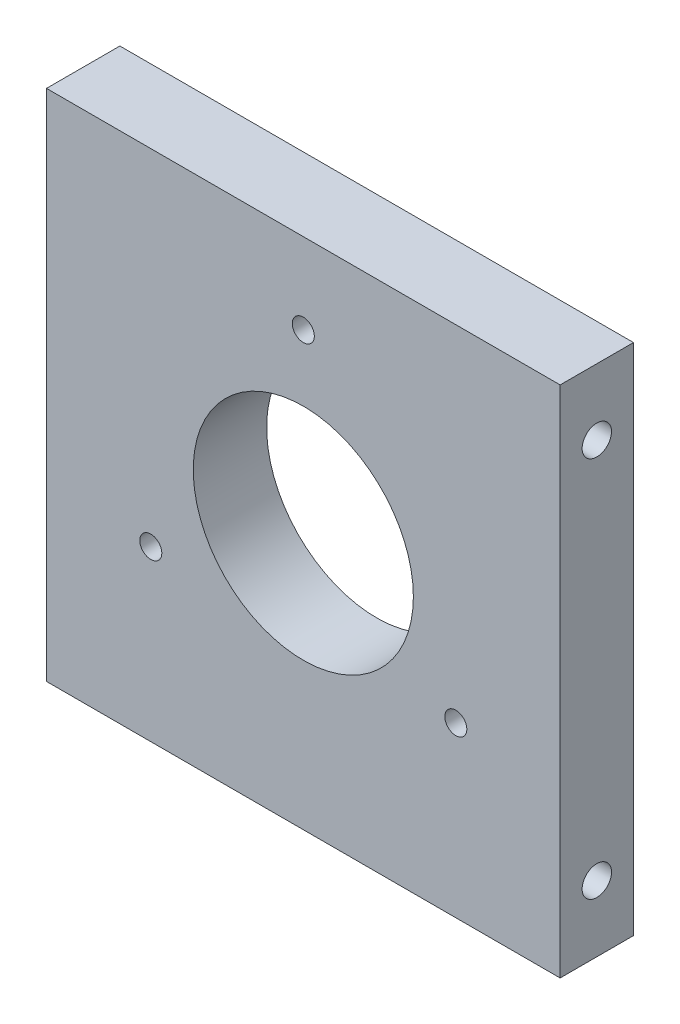
ISO-10303-21;
HEADER;
FILE_DESCRIPTION(('STEP AP214'),'2;1');
FILE_NAME('part.step','',(''),(''),'','','');
FILE_SCHEMA(('AUTOMOTIVE_DESIGN { 1 0 10303 214 1 1 1 1 }'));
ENDSEC;
DATA;
#1=APPLICATION_CONTEXT('core data for automotive mechanical design processes');
#2=APPLICATION_PROTOCOL_DEFINITION('international standard','automotive_design',2000,#1);
#3=PRODUCT_CONTEXT('',#1,'mechanical');
#4=PRODUCT('Part','Part','',(#3));
#5=PRODUCT_RELATED_PRODUCT_CATEGORY('part','',(#4));
#6=PRODUCT_DEFINITION_FORMATION('','',#4);
#7=PRODUCT_DEFINITION_CONTEXT('part definition',#1,'design');
#8=PRODUCT_DEFINITION('design','',#6,#7);
#9=PRODUCT_DEFINITION_SHAPE('','',#8);
#10=(LENGTH_UNIT() NAMED_UNIT(*) SI_UNIT(.MILLI.,.METRE.));
#11=(NAMED_UNIT(*) PLANE_ANGLE_UNIT() SI_UNIT($,.RADIAN.));
#12=(NAMED_UNIT(*) SI_UNIT($,.STERADIAN.) SOLID_ANGLE_UNIT());
#13=UNCERTAINTY_MEASURE_WITH_UNIT(LENGTH_MEASURE(1.E-05),#10,'distance_accuracy_value','');
#14=(GEOMETRIC_REPRESENTATION_CONTEXT(3) GLOBAL_UNCERTAINTY_ASSIGNED_CONTEXT((#13)) GLOBAL_UNIT_ASSIGNED_CONTEXT((#10,
#11,#12)) REPRESENTATION_CONTEXT('',''));
#15=CARTESIAN_POINT('',(0.,0.,0.));
#16=DIRECTION('',(0.,0.,1.));
#17=DIRECTION('',(1.,0.,0.));
#18=AXIS2_PLACEMENT_3D('',#15,#16,#17);
#19=CARTESIAN_POINT('',(12.0014,61.,5.0105));
#20=DIRECTION('',(1.,0.,0.));
#21=DIRECTION('',(0.,0.,-1.));
#22=AXIS2_PLACEMENT_3D('',#19,#20,#21);
#23=PLANE('',#22);
#24=CARTESIAN_POINT('',(12.0014,61.,5.0105));
#25=DIRECTION('',(1.,0.,0.));
#26=DIRECTION('',(0.,0.,-1.));
#27=AXIS2_PLACEMENT_3D('',#24,#25,#26);
#28=CIRCLE('',#27,2.);
#29=CARTESIAN_POINT('',(12.0014,61.,3.0105));
#30=VERTEX_POINT('',#29);
#31=EDGE_CURVE('E19',#30,#30,#28,.F.);
#32=ORIENTED_EDGE('',*,*,#31,.T.);
#33=EDGE_LOOP('',(#32));
#34=FACE_BOUND('',#33,.T.);
#35=ADVANCED_FACE('F16',(#34),#23,.F.);
#36=CARTESIAN_POINT('',(12.0014,9.,5.0105));
#37=DIRECTION('',(1.,0.,0.));
#38=DIRECTION('',(0.,0.,-1.));
#39=AXIS2_PLACEMENT_3D('',#36,#37,#38);
#40=PLANE('',#39);
#41=CARTESIAN_POINT('',(12.0014,9.,5.0105));
#42=DIRECTION('',(1.,0.,0.));
#43=DIRECTION('',(0.,0.,-1.));
#44=AXIS2_PLACEMENT_3D('',#41,#42,#43);
#45=CIRCLE('',#44,2.);
#46=CARTESIAN_POINT('',(12.0014,9.,3.0105));
#47=VERTEX_POINT('',#46);
#48=EDGE_CURVE('E122',#47,#47,#45,.F.);
#49=ORIENTED_EDGE('',*,*,#48,.T.);
#50=EDGE_LOOP('',(#49));
#51=FACE_BOUND('',#50,.T.);
#52=ADVANCED_FACE('F200',(#51),#40,.F.);
#53=CARTESIAN_POINT('',(58.0014,61.,5.0105));
#54=DIRECTION('',(-1.,0.,0.));
#55=DIRECTION('',(0.,0.,1.));
#56=AXIS2_PLACEMENT_3D('',#53,#54,#55);
#57=PLANE('',#56);
#58=CARTESIAN_POINT('',(58.0014,61.,5.0105));
#59=DIRECTION('',(-1.,0.,0.));
#60=DIRECTION('',(0.,0.,1.));
#61=AXIS2_PLACEMENT_3D('',#58,#59,#60);
#62=CIRCLE('',#61,2.);
#63=CARTESIAN_POINT('',(58.0014,61.,7.0105));
#64=VERTEX_POINT('',#63);
#65=EDGE_CURVE('E120',#64,#64,#62,.F.);
#66=ORIENTED_EDGE('',*,*,#65,.T.);
#67=EDGE_LOOP('',(#66));
#68=FACE_BOUND('',#67,.T.);
#69=ADVANCED_FACE('F144',(#68),#57,.F.);
#70=CARTESIAN_POINT('',(58.0014,9.,5.0105));
#71=DIRECTION('',(-1.,0.,0.));
#72=DIRECTION('',(0.,0.,1.));
#73=AXIS2_PLACEMENT_3D('',#70,#71,#72);
#74=PLANE('',#73);
#75=CARTESIAN_POINT('',(58.0014,9.,5.0105));
#76=DIRECTION('',(-1.,0.,0.));
#77=DIRECTION('',(0.,0.,1.));
#78=AXIS2_PLACEMENT_3D('',#75,#76,#77);
#79=CIRCLE('',#78,2.);
#80=CARTESIAN_POINT('',(58.0014,9.,7.0105));
#81=VERTEX_POINT('',#80);
#82=EDGE_CURVE('E74',#81,#81,#79,.F.);
#83=ORIENTED_EDGE('',*,*,#82,.T.);
#84=EDGE_LOOP('',(#83));
#85=FACE_BOUND('',#84,.T.);
#86=ADVANCED_FACE('F133',(#85),#74,.F.);
#87=CARTESIAN_POINT('',(0.00139999999999,61.,5.0105));
#88=DIRECTION('',(1.,0.,0.));
#89=DIRECTION('',(0.,0.,-1.));
#90=AXIS2_PLACEMENT_3D('',#87,#88,#89);
#91=CYLINDRICAL_SURFACE('',#90,2.);
#92=CARTESIAN_POINT('',(0.00139999999999,61.,5.0105));
#93=DIRECTION('',(1.,0.,0.));
#94=DIRECTION('',(0.,0.,-1.));
#95=AXIS2_PLACEMENT_3D('',#92,#93,#94);
#96=CIRCLE('',#95,2.);
#97=CARTESIAN_POINT('',(0.00139999999999,61.,3.0105));
#98=VERTEX_POINT('',#97);
#99=EDGE_CURVE('E73',#98,#98,#96,.F.);
#100=ORIENTED_EDGE('',*,*,#99,.T.);
#101=EDGE_LOOP('',(#100));
#102=FACE_BOUND('',#101,.T.);
#103=ORIENTED_EDGE('',*,*,#31,.F.);
#104=EDGE_LOOP('',(#103));
#105=FACE_BOUND('',#104,.T.);
#106=ADVANCED_FACE('F130',(#102,#105),#91,.F.);
#107=CARTESIAN_POINT('',(0.00139999999999,9.,5.0105));
#108=DIRECTION('',(1.,0.,0.));
#109=DIRECTION('',(0.,0.,-1.));
#110=AXIS2_PLACEMENT_3D('',#107,#108,#109);
#111=CYLINDRICAL_SURFACE('',#110,2.);
#112=CARTESIAN_POINT('',(0.00139999999999,9.,5.0105));
#113=DIRECTION('',(1.,0.,0.));
#114=DIRECTION('',(0.,0.,-1.));
#115=AXIS2_PLACEMENT_3D('',#112,#113,#114);
#116=CIRCLE('',#115,2.);
#117=CARTESIAN_POINT('',(0.00139999999999,9.,3.0105));
#118=VERTEX_POINT('',#117);
#119=EDGE_CURVE('E65',#118,#118,#116,.F.);
#120=ORIENTED_EDGE('',*,*,#119,.T.);
#121=EDGE_LOOP('',(#120));
#122=FACE_BOUND('',#121,.T.);
#123=ORIENTED_EDGE('',*,*,#48,.F.);
#124=EDGE_LOOP('',(#123));
#125=FACE_BOUND('',#124,.T.);
#126=ADVANCED_FACE('F132',(#122,#125),#111,.F.);
#127=CARTESIAN_POINT('',(70.0014,61.,5.0105));
#128=DIRECTION('',(-1.,0.,0.));
#129=DIRECTION('',(0.,0.,1.));
#130=AXIS2_PLACEMENT_3D('',#127,#128,#129);
#131=CYLINDRICAL_SURFACE('',#130,2.);
#132=CARTESIAN_POINT('',(70.0014,61.,5.0105));
#133=DIRECTION('',(-1.,0.,0.));
#134=DIRECTION('',(0.,0.,1.));
#135=AXIS2_PLACEMENT_3D('',#132,#133,#134);
#136=CIRCLE('',#135,2.);
#137=CARTESIAN_POINT('',(70.0014,61.,7.0105));
#138=VERTEX_POINT('',#137);
#139=EDGE_CURVE('E111',#138,#138,#136,.T.);
#140=ORIENTED_EDGE('',*,*,#139,.F.);
#141=EDGE_LOOP('',(#140));
#142=FACE_BOUND('',#141,.T.);
#143=ORIENTED_EDGE('',*,*,#65,.F.);
#144=EDGE_LOOP('',(#143));
#145=FACE_BOUND('',#144,.T.);
#146=ADVANCED_FACE('F141',(#142,#145),#131,.F.);
#147=CARTESIAN_POINT('',(70.0014,9.,5.0105));
#148=DIRECTION('',(-1.,0.,0.));
#149=DIRECTION('',(0.,0.,1.));
#150=AXIS2_PLACEMENT_3D('',#147,#148,#149);
#151=CYLINDRICAL_SURFACE('',#150,2.);
#152=CARTESIAN_POINT('',(70.0014,9.,5.0105));
#153=DIRECTION('',(-1.,0.,0.));
#154=DIRECTION('',(0.,0.,1.));
#155=AXIS2_PLACEMENT_3D('',#152,#153,#154);
#156=CIRCLE('',#155,2.);
#157=CARTESIAN_POINT('',(70.0014,9.,7.0105));
#158=VERTEX_POINT('',#157);
#159=EDGE_CURVE('E107',#158,#158,#156,.T.);
#160=ORIENTED_EDGE('',*,*,#159,.F.);
#161=EDGE_LOOP('',(#160));
#162=FACE_BOUND('',#161,.T.);
#163=ORIENTED_EDGE('',*,*,#82,.F.);
#164=EDGE_LOOP('',(#163));
#165=FACE_BOUND('',#164,.T.);
#166=ADVANCED_FACE('F186',(#162,#165),#151,.F.);
#167=CARTESIAN_POINT('',(0.00139999999999,0.,0.01050000000032));
#168=DIRECTION('',(0.,0.,1.));
#169=DIRECTION('',(1.,0.,0.));
#170=AXIS2_PLACEMENT_3D('',#167,#168,#169);
#171=PLANE('',#170);
#172=CARTESIAN_POINT('',(35.0014,59.,0.01050000000009));
#173=DIRECTION('',(0.,0.,1.));
#174=DIRECTION('',(1.,0.,0.));
#175=AXIS2_PLACEMENT_3D('',#172,#173,#174);
#176=CIRCLE('',#175,1.5);
#177=CARTESIAN_POINT('',(36.5014,59.,0.01050000000009));
#178=VERTEX_POINT('',#177);
#179=EDGE_CURVE('E94',#178,#178,#176,.T.);
#180=ORIENTED_EDGE('',*,*,#179,.T.);
#181=EDGE_LOOP('',(#180));
#182=FACE_BOUND('',#181,.T.);
#183=CARTESIAN_POINT('',(35.0014,35.,0.01050000000009));
#184=DIRECTION('',(0.,0.,1.));
#185=DIRECTION('',(1.,0.,0.));
#186=AXIS2_PLACEMENT_3D('',#183,#184,#185);
#187=CIRCLE('',#186,15.);
#188=CARTESIAN_POINT('',(50.0014,35.,0.01050000000009));
#189=VERTEX_POINT('',#188);
#190=EDGE_CURVE('E98',#189,#189,#187,.T.);
#191=ORIENTED_EDGE('',*,*,#190,.T.);
#192=EDGE_LOOP('',(#191));
#193=FACE_BOUND('',#192,.T.);
#194=CARTESIAN_POINT('',(55.786009690827,23.,0.01050000000009));
#195=DIRECTION('',(0.,0.,1.));
#196=DIRECTION('',(1.,0.,0.));
#197=AXIS2_PLACEMENT_3D('',#194,#195,#196);
#198=CIRCLE('',#197,1.5);
#199=CARTESIAN_POINT('',(57.286009690827,23.,0.01050000000009));
#200=VERTEX_POINT('',#199);
#201=EDGE_CURVE('E101',#200,#200,#198,.T.);
#202=ORIENTED_EDGE('',*,*,#201,.T.);
#203=EDGE_LOOP('',(#202));
#204=FACE_BOUND('',#203,.T.);
#205=CARTESIAN_POINT('',(14.216790309173,23.,0.01050000000009));
#206=DIRECTION('',(0.,0.,1.));
#207=DIRECTION('',(1.,0.,0.));
#208=AXIS2_PLACEMENT_3D('',#205,#206,#207);
#209=CIRCLE('',#208,1.5);
#210=CARTESIAN_POINT('',(15.716790309173,23.,0.01050000000009));
#211=VERTEX_POINT('',#210);
#212=EDGE_CURVE('E104',#211,#211,#209,.T.);
#213=ORIENTED_EDGE('',*,*,#212,.T.);
#214=EDGE_LOOP('',(#213));
#215=FACE_BOUND('',#214,.T.);
#216=DIRECTION('',(0.,1.,0.));
#217=VECTOR('',#216,1.);
#218=CARTESIAN_POINT('',(70.0014,0.,0.01050000000009));
#219=LINE('',#218,#217);
#220=CARTESIAN_POINT('',(70.0014,0.,0.0105000000001475));
#221=VERTEX_POINT('',#220);
#222=CARTESIAN_POINT('',(70.0014,70.,0.010500000000205));
#223=VERTEX_POINT('',#222);
#224=EDGE_CURVE('E62',#221,#223,#219,.T.);
#225=ORIENTED_EDGE('',*,*,#224,.F.);
#226=DIRECTION('',(1.,0.,0.));
#227=VECTOR('',#226,1.);
#228=CARTESIAN_POINT('',(0.00139999999999,0.,0.01050000000009));
#229=LINE('',#228,#227);
#230=CARTESIAN_POINT('',(0.00139999999999,0.,0.010500000000205));
#231=VERTEX_POINT('',#230);
#232=EDGE_CURVE('E55',#221,#231,#229,.F.);
#233=ORIENTED_EDGE('',*,*,#232,.T.);
#234=DIRECTION('',(0.,1.,0.));
#235=VECTOR('',#234,1.);
#236=CARTESIAN_POINT('',(0.00139999999999,0.,0.01050000000009));
#237=LINE('',#236,#235);
#238=CARTESIAN_POINT('',(0.00139999999999,70.,0.010500000000205));
#239=VERTEX_POINT('',#238);
#240=EDGE_CURVE('E60',#231,#239,#237,.T.);
#241=ORIENTED_EDGE('',*,*,#240,.T.);
#242=DIRECTION('',(1.,0.,0.));
#243=VECTOR('',#242,1.);
#244=CARTESIAN_POINT('',(0.00139999999999,70.,0.01050000000009));
#245=LINE('',#244,#243);
#246=EDGE_CURVE('E110',#223,#239,#245,.F.);
#247=ORIENTED_EDGE('',*,*,#246,.F.);
#248=EDGE_LOOP('',(#225,#233,#241,#247));
#249=FACE_BOUND('',#248,.T.);
#250=ADVANCED_FACE('F59',(#182,#193,#204,#215,#249),#171,.F.);
#251=CARTESIAN_POINT('',(0.00139999999999,0.,0.01050000000032));
#252=DIRECTION('',(1.,0.,0.));
#253=DIRECTION('',(0.,0.,-1.));
#254=AXIS2_PLACEMENT_3D('',#251,#252,#253);
#255=PLANE('',#254);
#256=ORIENTED_EDGE('',*,*,#119,.F.);
#257=EDGE_LOOP('',(#256));
#258=FACE_BOUND('',#257,.T.);
#259=ORIENTED_EDGE('',*,*,#99,.F.);
#260=EDGE_LOOP('',(#259));
#261=FACE_BOUND('',#260,.T.);
#262=DIRECTION('',(0.,0.,1.));
#263=VECTOR('',#262,1.);
#264=CARTESIAN_POINT('',(0.00139999999999,70.,0.01050000000032));
#265=LINE('',#264,#263);
#266=CARTESIAN_POINT('',(0.00139999999999,70.,10.0105));
#267=VERTEX_POINT('',#266);
#268=EDGE_CURVE('E71',#239,#267,#265,.T.);
#269=ORIENTED_EDGE('',*,*,#268,.F.);
#270=ORIENTED_EDGE('',*,*,#240,.F.);
#271=DIRECTION('',(0.,0.,1.));
#272=VECTOR('',#271,1.);
#273=CARTESIAN_POINT('',(0.00139999999999,0.,0.01050000000032));
#274=LINE('',#273,#272);
#275=CARTESIAN_POINT('',(0.00139999999999,0.,10.0105));
#276=VERTEX_POINT('',#275);
#277=EDGE_CURVE('E64',#231,#276,#274,.T.);
#278=ORIENTED_EDGE('',*,*,#277,.T.);
#279=DIRECTION('',(0.,1.,0.));
#280=VECTOR('',#279,1.);
#281=CARTESIAN_POINT('',(0.00139999999999,0.,10.0105));
#282=LINE('',#281,#280);
#283=EDGE_CURVE('E97',#267,#276,#282,.F.);
#284=ORIENTED_EDGE('',*,*,#283,.F.);
#285=EDGE_LOOP('',(#269,#270,#278,#284));
#286=FACE_BOUND('',#285,.T.);
#287=ADVANCED_FACE('F68',(#258,#261,#286),#255,.F.);
#288=CARTESIAN_POINT('',(0.00139999999999,0.,0.01050000000032));
#289=DIRECTION('',(0.,1.,0.));
#290=DIRECTION('',(0.,0.,1.));
#291=AXIS2_PLACEMENT_3D('',#288,#289,#290);
#292=PLANE('',#291);
#293=DIRECTION('',(1.,0.,0.));
#294=VECTOR('',#293,1.);
#295=CARTESIAN_POINT('',(0.00139999999999,0.,10.0105));
#296=LINE('',#295,#294);
#297=CARTESIAN_POINT('',(70.0014,0.,10.0105));
#298=VERTEX_POINT('',#297);
#299=EDGE_CURVE('E78',#276,#298,#296,.T.);
#300=ORIENTED_EDGE('',*,*,#299,.F.);
#301=ORIENTED_EDGE('',*,*,#277,.F.);
#302=ORIENTED_EDGE('',*,*,#232,.F.);
#303=DIRECTION('',(0.,0.,-1.));
#304=VECTOR('',#303,1.);
#305=CARTESIAN_POINT('',(70.0014,0.,0.01050000000032));
#306=LINE('',#305,#304);
#307=EDGE_CURVE('E80',#298,#221,#306,.T.);
#308=ORIENTED_EDGE('',*,*,#307,.F.);
#309=EDGE_LOOP('',(#300,#301,#302,#308));
#310=FACE_BOUND('',#309,.T.);
#311=ADVANCED_FACE('F76',(#310),#292,.F.);
#312=CARTESIAN_POINT('',(70.0014,0.,0.01050000000032));
#313=DIRECTION('',(1.,0.,0.));
#314=DIRECTION('',(0.,0.,-1.));
#315=AXIS2_PLACEMENT_3D('',#312,#313,#314);
#316=PLANE('',#315);
#317=ORIENTED_EDGE('',*,*,#159,.T.);
#318=EDGE_LOOP('',(#317));
#319=FACE_BOUND('',#318,.T.);
#320=ORIENTED_EDGE('',*,*,#139,.T.);
#321=EDGE_LOOP('',(#320));
#322=FACE_BOUND('',#321,.T.);
#323=DIRECTION('',(0.,0.,1.));
#324=VECTOR('',#323,1.);
#325=CARTESIAN_POINT('',(70.0014,70.,0.01050000000032));
#326=LINE('',#325,#324);
#327=CARTESIAN_POINT('',(70.0014,70.,10.0105));
#328=VERTEX_POINT('',#327);
#329=EDGE_CURVE('E34',#328,#223,#326,.F.);
#330=ORIENTED_EDGE('',*,*,#329,.F.);
#331=DIRECTION('',(0.,1.,0.));
#332=VECTOR('',#331,1.);
#333=CARTESIAN_POINT('',(70.0014,0.,10.0105));
#334=LINE('',#333,#332);
#335=EDGE_CURVE('E330',#298,#328,#334,.T.);
#336=ORIENTED_EDGE('',*,*,#335,.F.);
#337=ORIENTED_EDGE('',*,*,#307,.T.);
#338=ORIENTED_EDGE('',*,*,#224,.T.);
#339=EDGE_LOOP('',(#330,#336,#337,#338));
#340=FACE_BOUND('',#339,.T.);
#341=ADVANCED_FACE('F174',(#319,#322,#340),#316,.T.);
#342=CARTESIAN_POINT('',(0.00139999999999,70.,0.01050000000032));
#343=DIRECTION('',(0.,1.,0.));
#344=DIRECTION('',(0.,0.,1.));
#345=AXIS2_PLACEMENT_3D('',#342,#343,#344);
#346=PLANE('',#345);
#347=DIRECTION('',(1.,0.,0.));
#348=VECTOR('',#347,1.);
#349=CARTESIAN_POINT('',(0.00139999999999,70.,10.0105));
#350=LINE('',#349,#348);
#351=EDGE_CURVE('E93',#328,#267,#350,.F.);
#352=ORIENTED_EDGE('',*,*,#351,.F.);
#353=ORIENTED_EDGE('',*,*,#329,.T.);
#354=ORIENTED_EDGE('',*,*,#246,.T.);
#355=ORIENTED_EDGE('',*,*,#268,.T.);
#356=EDGE_LOOP('',(#352,#353,#354,#355));
#357=FACE_BOUND('',#356,.T.);
#358=ADVANCED_FACE('F170',(#357),#346,.T.);
#359=CARTESIAN_POINT('',(14.216790309173,23.,0.01050000000032));
#360=DIRECTION('',(0.,0.,1.));
#361=DIRECTION('',(1.,0.,0.));
#362=AXIS2_PLACEMENT_3D('',#359,#360,#361);
#363=CYLINDRICAL_SURFACE('',#362,1.5);
#364=ORIENTED_EDGE('',*,*,#212,.F.);
#365=EDGE_LOOP('',(#364));
#366=FACE_BOUND('',#365,.T.);
#367=CARTESIAN_POINT('',(14.216790309173,23.,10.0105));
#368=DIRECTION('',(0.,0.,1.));
#369=DIRECTION('',(1.,0.,0.));
#370=AXIS2_PLACEMENT_3D('',#367,#368,#369);
#371=CIRCLE('',#370,1.5);
#372=CARTESIAN_POINT('',(15.716790309173,23.,10.0105));
#373=VERTEX_POINT('',#372);
#374=EDGE_CURVE('E90',#373,#373,#371,.F.);
#375=ORIENTED_EDGE('',*,*,#374,.F.);
#376=EDGE_LOOP('',(#375));
#377=FACE_BOUND('',#376,.T.);
#378=ADVANCED_FACE('F166',(#366,#377),#363,.F.);
#379=CARTESIAN_POINT('',(55.786009690827,23.,0.01050000000032));
#380=DIRECTION('',(0.,0.,1.));
#381=DIRECTION('',(1.,0.,0.));
#382=AXIS2_PLACEMENT_3D('',#379,#380,#381);
#383=CYLINDRICAL_SURFACE('',#382,1.5);
#384=ORIENTED_EDGE('',*,*,#201,.F.);
#385=EDGE_LOOP('',(#384));
#386=FACE_BOUND('',#385,.T.);
#387=CARTESIAN_POINT('',(55.786009690827,23.,10.0105));
#388=DIRECTION('',(0.,0.,1.));
#389=DIRECTION('',(1.,0.,0.));
#390=AXIS2_PLACEMENT_3D('',#387,#388,#389);
#391=CIRCLE('',#390,1.5);
#392=CARTESIAN_POINT('',(57.286009690827,23.,10.0105));
#393=VERTEX_POINT('',#392);
#394=EDGE_CURVE('E87',#393,#393,#391,.F.);
#395=ORIENTED_EDGE('',*,*,#394,.F.);
#396=EDGE_LOOP('',(#395));
#397=FACE_BOUND('',#396,.T.);
#398=ADVANCED_FACE('F162',(#386,#397),#383,.F.);
#399=CARTESIAN_POINT('',(35.0014,35.,0.01050000000032));
#400=DIRECTION('',(0.,0.,1.));
#401=DIRECTION('',(1.,0.,0.));
#402=AXIS2_PLACEMENT_3D('',#399,#400,#401);
#403=CYLINDRICAL_SURFACE('',#402,15.);
#404=ORIENTED_EDGE('',*,*,#190,.F.);
#405=EDGE_LOOP('',(#404));
#406=FACE_BOUND('',#405,.T.);
#407=CARTESIAN_POINT('',(35.0014,35.,10.0105));
#408=DIRECTION('',(0.,0.,1.));
#409=DIRECTION('',(1.,0.,0.));
#410=AXIS2_PLACEMENT_3D('',#407,#408,#409);
#411=CIRCLE('',#410,15.);
#412=CARTESIAN_POINT('',(50.0014,35.,10.0105));
#413=VERTEX_POINT('',#412);
#414=EDGE_CURVE('E25',#413,#413,#411,.F.);
#415=ORIENTED_EDGE('',*,*,#414,.F.);
#416=EDGE_LOOP('',(#415));
#417=FACE_BOUND('',#416,.T.);
#418=ADVANCED_FACE('F155',(#406,#417),#403,.F.);
#419=CARTESIAN_POINT('',(35.0014,59.,0.01050000000032));
#420=DIRECTION('',(0.,0.,1.));
#421=DIRECTION('',(1.,0.,0.));
#422=AXIS2_PLACEMENT_3D('',#419,#420,#421);
#423=CYLINDRICAL_SURFACE('',#422,1.5);
#424=ORIENTED_EDGE('',*,*,#179,.F.);
#425=EDGE_LOOP('',(#424));
#426=FACE_BOUND('',#425,.T.);
#427=CARTESIAN_POINT('',(35.0014,59.,10.0105));
#428=DIRECTION('',(0.,0.,1.));
#429=DIRECTION('',(1.,0.,0.));
#430=AXIS2_PLACEMENT_3D('',#427,#428,#429);
#431=CIRCLE('',#430,1.5);
#432=CARTESIAN_POINT('',(36.5014,59.,10.0105));
#433=VERTEX_POINT('',#432);
#434=EDGE_CURVE('E11',#433,#433,#431,.F.);
#435=ORIENTED_EDGE('',*,*,#434,.F.);
#436=EDGE_LOOP('',(#435));
#437=FACE_BOUND('',#436,.T.);
#438=ADVANCED_FACE('F149',(#426,#437),#423,.F.);
#439=CARTESIAN_POINT('',(0.00139999999999,0.,10.0105));
#440=DIRECTION('',(0.,0.,1.));
#441=DIRECTION('',(1.,0.,0.));
#442=AXIS2_PLACEMENT_3D('',#439,#440,#441);
#443=PLANE('',#442);
#444=ORIENTED_EDGE('',*,*,#434,.T.);
#445=EDGE_LOOP('',(#444));
#446=FACE_BOUND('',#445,.T.);
#447=ORIENTED_EDGE('',*,*,#414,.T.);
#448=EDGE_LOOP('',(#447));
#449=FACE_BOUND('',#448,.T.);
#450=ORIENTED_EDGE('',*,*,#394,.T.);
#451=EDGE_LOOP('',(#450));
#452=FACE_BOUND('',#451,.T.);
#453=ORIENTED_EDGE('',*,*,#374,.T.);
#454=EDGE_LOOP('',(#453));
#455=FACE_BOUND('',#454,.T.);
#456=ORIENTED_EDGE('',*,*,#335,.T.);
#457=ORIENTED_EDGE('',*,*,#351,.T.);
#458=ORIENTED_EDGE('',*,*,#283,.T.);
#459=ORIENTED_EDGE('',*,*,#299,.T.);
#460=EDGE_LOOP('',(#456,#457,#458,#459));
#461=FACE_BOUND('',#460,.T.);
#462=ADVANCED_FACE('F147',(#446,#449,#452,#455,#461),#443,.T.);
#463=CLOSED_SHELL('',(#35,#52,#69,#86,#106,#126,#146,#166,#250,#287,#311,#341,#358,#378,#398,
#418,#438,#462));
#464=MANIFOLD_SOLID_BREP('B1',#463);
#465=ADVANCED_BREP_SHAPE_REPRESENTATION('',(#18,#464),#14);
#466=SHAPE_DEFINITION_REPRESENTATION(#9,#465);
ENDSEC;
END-ISO-10303-21;
